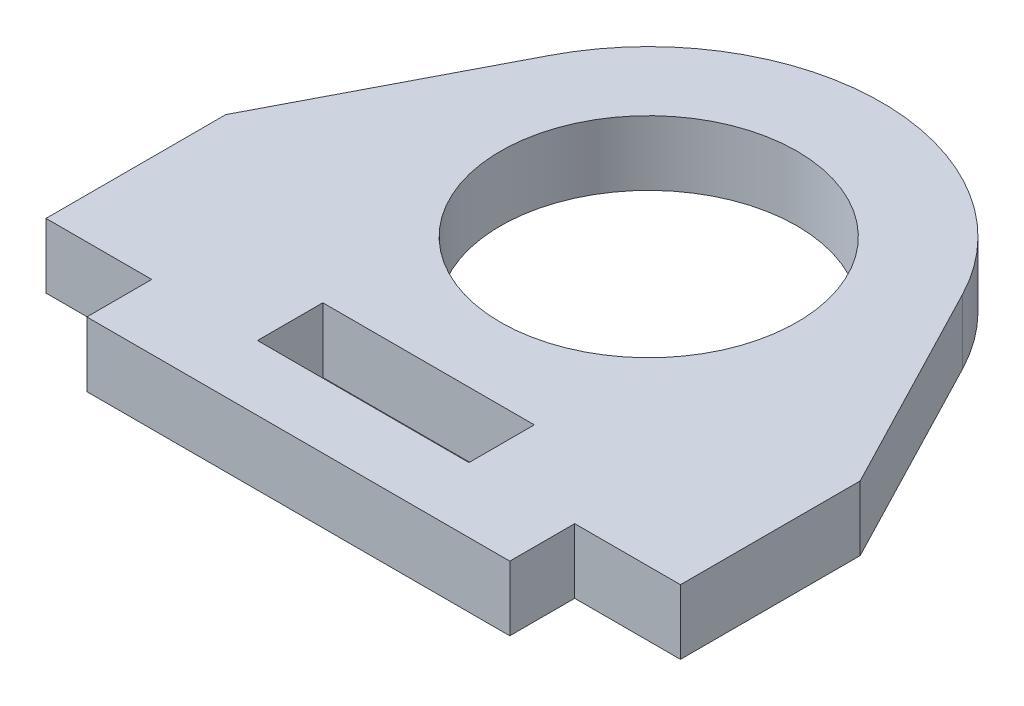
ISO-10303-21;
HEADER;
FILE_DESCRIPTION(('STEP AP214'),'2;1');
FILE_NAME('part.step','',(''),(''),'','','');
FILE_SCHEMA(('AUTOMOTIVE_DESIGN { 1 0 10303 214 1 1 1 1 }'));
ENDSEC;
DATA;
#1=APPLICATION_CONTEXT('core data for automotive mechanical design processes');
#2=APPLICATION_PROTOCOL_DEFINITION('international standard','automotive_design',2000,#1);
#3=PRODUCT_CONTEXT('',#1,'mechanical');
#4=PRODUCT('Part','Part','',(#3));
#5=PRODUCT_RELATED_PRODUCT_CATEGORY('part','',(#4));
#6=PRODUCT_DEFINITION_FORMATION('','',#4);
#7=PRODUCT_DEFINITION_CONTEXT('part definition',#1,'design');
#8=PRODUCT_DEFINITION('design','',#6,#7);
#9=PRODUCT_DEFINITION_SHAPE('','',#8);
#10=(LENGTH_UNIT() NAMED_UNIT(*) SI_UNIT(.MILLI.,.METRE.));
#11=(NAMED_UNIT(*) PLANE_ANGLE_UNIT() SI_UNIT($,.RADIAN.));
#12=(NAMED_UNIT(*) SI_UNIT($,.STERADIAN.) SOLID_ANGLE_UNIT());
#13=UNCERTAINTY_MEASURE_WITH_UNIT(LENGTH_MEASURE(1.E-05),#10,'distance_accuracy_value','');
#14=(GEOMETRIC_REPRESENTATION_CONTEXT(3) GLOBAL_UNCERTAINTY_ASSIGNED_CONTEXT((#13)) GLOBAL_UNIT_ASSIGNED_CONTEXT((#10,
#11,#12)) REPRESENTATION_CONTEXT('',''));
#15=CARTESIAN_POINT('',(0.,0.,0.));
#16=DIRECTION('',(0.,0.,1.));
#17=DIRECTION('',(1.,0.,0.));
#18=AXIS2_PLACEMENT_3D('',#15,#16,#17);
#19=CARTESIAN_POINT('',(-20.,-191.87,-16.57));
#20=DIRECTION('',(0.,1.,0.));
#21=DIRECTION('',(0.,0.,-1.));
#22=AXIS2_PLACEMENT_3D('',#19,#20,#21);
#23=PLANE('',#22);
#24=DIRECTION('',(0.,0.,-1.));
#25=VECTOR('',#24,1.);
#26=CARTESIAN_POINT('',(-15.,-191.87,-16.57));
#27=LINE('',#26,#25);
#28=CARTESIAN_POINT('',(-15.,-191.87,-3.07));
#29=VERTEX_POINT('',#28);
#30=CARTESIAN_POINT('',(-15.,-191.87,-6.16));
#31=VERTEX_POINT('',#30);
#32=EDGE_CURVE('E177',#29,#31,#27,.T.);
#33=ORIENTED_EDGE('',*,*,#32,.F.);
#34=DIRECTION('',(1.,0.,0.));
#35=VECTOR('',#34,1.);
#36=CARTESIAN_POINT('',(-20.,-191.87,-3.07));
#37=LINE('',#36,#35);
#38=CARTESIAN_POINT('',(-25.,-191.87,-3.07));
#39=VERTEX_POINT('',#38);
#40=EDGE_CURVE('E169',#39,#29,#37,.T.);
#41=ORIENTED_EDGE('',*,*,#40,.F.);
#42=DIRECTION('',(0.,0.,1.));
#43=VECTOR('',#42,1.);
#44=CARTESIAN_POINT('',(-25.,-191.87,-16.57));
#45=LINE('',#44,#43);
#46=CARTESIAN_POINT('',(-25.,-191.87,-6.16));
#47=VERTEX_POINT('',#46);
#48=EDGE_CURVE('E148',#47,#39,#45,.T.);
#49=ORIENTED_EDGE('',*,*,#48,.F.);
#50=DIRECTION('',(-1.,0.,0.));
#51=VECTOR('',#50,1.);
#52=CARTESIAN_POINT('',(-20.,-191.87,-6.16));
#53=LINE('',#52,#51);
#54=EDGE_CURVE('E174',#31,#47,#53,.T.);
#55=ORIENTED_EDGE('',*,*,#54,.F.);
#56=EDGE_LOOP('',(#33,#41,#49,#55));
#57=FACE_BOUND('',#56,.T.);
#58=DIRECTION('',(0.,0.,1.));
#59=VECTOR('',#58,1.);
#60=CARTESIAN_POINT('',(-35.,-191.87,-11.57));
#61=LINE('',#60,#59);
#62=CARTESIAN_POINT('',(-35.,-191.87,-11.57));
#63=VERTEX_POINT('',#62);
#64=CARTESIAN_POINT('',(-35.,-191.87,-3.07));
#65=VERTEX_POINT('',#64);
#66=EDGE_CURVE('E187',#63,#65,#61,.T.);
#67=ORIENTED_EDGE('',*,*,#66,.T.);
#68=DIRECTION('',(1.,0.,0.));
#69=VECTOR('',#68,1.);
#70=CARTESIAN_POINT('',(-35.,-191.87,-3.07));
#71=LINE('',#70,#69);
#72=CARTESIAN_POINT('',(-30.,-191.87,-3.07));
#73=VERTEX_POINT('',#72);
#74=EDGE_CURVE('E190',#65,#73,#71,.T.);
#75=ORIENTED_EDGE('',*,*,#74,.T.);
#76=DIRECTION('',(0.,0.,1.));
#77=VECTOR('',#76,1.);
#78=CARTESIAN_POINT('',(-30.,-191.87,-3.07));
#79=LINE('',#78,#77);
#80=CARTESIAN_POINT('',(-30.,-191.87,0.));
#81=VERTEX_POINT('',#80);
#82=EDGE_CURVE('E194',#73,#81,#79,.T.);
#83=ORIENTED_EDGE('',*,*,#82,.T.);
#84=DIRECTION('',(1.,0.,0.));
#85=VECTOR('',#84,1.);
#86=CARTESIAN_POINT('',(-30.,-191.87,0.));
#87=LINE('',#86,#85);
#88=CARTESIAN_POINT('',(-10.,-191.87,0.));
#89=VERTEX_POINT('',#88);
#90=EDGE_CURVE('E197',#81,#89,#87,.T.);
#91=ORIENTED_EDGE('',*,*,#90,.T.);
#92=DIRECTION('',(0.,0.,-1.));
#93=VECTOR('',#92,1.);
#94=CARTESIAN_POINT('',(-10.,-191.87,0.));
#95=LINE('',#94,#93);
#96=CARTESIAN_POINT('',(-10.,-191.87,-3.07));
#97=VERTEX_POINT('',#96);
#98=EDGE_CURVE('E200',#89,#97,#95,.T.);
#99=ORIENTED_EDGE('',*,*,#98,.T.);
#100=DIRECTION('',(1.,0.,0.));
#101=VECTOR('',#100,1.);
#102=CARTESIAN_POINT('',(-10.,-191.87,-3.07));
#103=LINE('',#102,#101);
#104=CARTESIAN_POINT('',(-5.,-191.87,-3.07));
#105=VERTEX_POINT('',#104);
#106=EDGE_CURVE('E203',#97,#105,#103,.T.);
#107=ORIENTED_EDGE('',*,*,#106,.T.);
#108=DIRECTION('',(0.,0.,-1.));
#109=VECTOR('',#108,1.);
#110=CARTESIAN_POINT('',(-5.,-191.87,-3.07));
#111=LINE('',#110,#109);
#112=CARTESIAN_POINT('',(-5.,-191.87,-11.57));
#113=VERTEX_POINT('',#112);
#114=EDGE_CURVE('E206',#105,#113,#111,.T.);
#115=ORIENTED_EDGE('',*,*,#114,.T.);
#116=DIRECTION('',(-0.460687391570735,0.,-0.887562463856912));
#117=VECTOR('',#116,1.);
#118=CARTESIAN_POINT('',(-5.,-191.87,-11.57));
#119=LINE('',#118,#117);
#120=CARTESIAN_POINT('',(-10.2279372729354,-191.87,-21.6421681811938));
#121=VERTEX_POINT('',#120);
#122=EDGE_CURVE('E209',#113,#121,#119,.T.);
#123=ORIENTED_EDGE('',*,*,#122,.T.);
#124=CARTESIAN_POINT('',(-20.,-191.87,-16.57));
#125=DIRECTION('',(0.,1.,0.));
#126=DIRECTION('',(0.,0.,-1.));
#127=AXIS2_PLACEMENT_3D('',#124,#125,#126);
#128=CIRCLE('',#127,11.01);
#129=CARTESIAN_POINT('',(-29.7720627270646,-191.87,-21.6421681811938));
#130=VERTEX_POINT('',#129);
#131=EDGE_CURVE('E212',#121,#130,#128,.T.);
#132=ORIENTED_EDGE('',*,*,#131,.T.);
#133=DIRECTION('',(-0.460687391570736,0.,0.887562463856911));
#134=VECTOR('',#133,1.);
#135=CARTESIAN_POINT('',(-35.,-191.87,-11.57));
#136=LINE('',#135,#134);
#137=EDGE_CURVE('E215',#130,#63,#136,.T.);
#138=ORIENTED_EDGE('',*,*,#137,.T.);
#139=EDGE_LOOP('',(#67,#75,#83,#91,#99,#107,#115,#123,#132,#138));
#140=FACE_BOUND('',#139,.T.);
#141=CARTESIAN_POINT('',(-20.,-191.87,-16.57));
#142=DIRECTION('',(0.,1.,0.));
#143=DIRECTION('',(0.,0.,-1.));
#144=AXIS2_PLACEMENT_3D('',#141,#142,#143);
#145=CIRCLE('',#144,7.01);
#146=CARTESIAN_POINT('',(-20.,-191.87,-23.58));
#147=VERTEX_POINT('',#146);
#148=EDGE_CURVE('E181',#147,#147,#145,.T.);
#149=ORIENTED_EDGE('',*,*,#148,.F.);
#150=EDGE_LOOP('',(#149));
#151=FACE_BOUND('',#150,.T.);
#152=ADVANCED_FACE('F45',(#57,#140,#151),#23,.T.);
#153=CARTESIAN_POINT('',(-20.,-194.93,-16.57));
#154=DIRECTION('',(0.,1.,0.));
#155=DIRECTION('',(0.,0.,-1.));
#156=AXIS2_PLACEMENT_3D('',#153,#154,#155);
#157=PLANE('',#156);
#158=DIRECTION('',(-1.,0.,0.));
#159=VECTOR('',#158,1.);
#160=CARTESIAN_POINT('',(-15.,-194.93,-3.07));
#161=LINE('',#160,#159);
#162=CARTESIAN_POINT('',(-15.,-194.93,-3.07));
#163=VERTEX_POINT('',#162);
#164=CARTESIAN_POINT('',(-25.,-194.93,-3.07));
#165=VERTEX_POINT('',#164);
#166=EDGE_CURVE('E157',#163,#165,#161,.T.);
#167=ORIENTED_EDGE('',*,*,#166,.F.);
#168=DIRECTION('',(0.,0.,1.));
#169=VECTOR('',#168,1.);
#170=CARTESIAN_POINT('',(-15.,-194.93,-3.07));
#171=LINE('',#170,#169);
#172=CARTESIAN_POINT('',(-15.,-194.93,-6.16));
#173=VERTEX_POINT('',#172);
#174=EDGE_CURVE('E162',#173,#163,#171,.T.);
#175=ORIENTED_EDGE('',*,*,#174,.F.);
#176=DIRECTION('',(1.,0.,0.));
#177=VECTOR('',#176,1.);
#178=CARTESIAN_POINT('',(-15.,-194.93,-6.16));
#179=LINE('',#178,#177);
#180=CARTESIAN_POINT('',(-25.,-194.93,-6.16));
#181=VERTEX_POINT('',#180);
#182=EDGE_CURVE('E159',#181,#173,#179,.T.);
#183=ORIENTED_EDGE('',*,*,#182,.F.);
#184=DIRECTION('',(0.,0.,-1.));
#185=VECTOR('',#184,1.);
#186=CARTESIAN_POINT('',(-25.,-194.93,-3.07));
#187=LINE('',#186,#185);
#188=EDGE_CURVE('E145',#165,#181,#187,.T.);
#189=ORIENTED_EDGE('',*,*,#188,.F.);
#190=EDGE_LOOP('',(#167,#175,#183,#189));
#191=FACE_BOUND('',#190,.T.);
#192=DIRECTION('',(0.,0.,1.));
#193=VECTOR('',#192,1.);
#194=CARTESIAN_POINT('',(-35.,-194.93,-11.57));
#195=LINE('',#194,#193);
#196=CARTESIAN_POINT('',(-35.,-194.93,-11.57));
#197=VERTEX_POINT('',#196);
#198=CARTESIAN_POINT('',(-35.,-194.93,-3.07));
#199=VERTEX_POINT('',#198);
#200=EDGE_CURVE('E184',#197,#199,#195,.T.);
#201=ORIENTED_EDGE('',*,*,#200,.F.);
#202=DIRECTION('',(-0.460687391570736,0.,0.887562463856911));
#203=VECTOR('',#202,1.);
#204=CARTESIAN_POINT('',(-35.,-194.93,-11.57));
#205=LINE('',#204,#203);
#206=CARTESIAN_POINT('',(-29.7720627270646,-194.93,-21.6421681811938));
#207=VERTEX_POINT('',#206);
#208=EDGE_CURVE('E191',#207,#197,#205,.T.);
#209=ORIENTED_EDGE('',*,*,#208,.F.);
#210=CARTESIAN_POINT('',(-20.,-194.93,-16.57));
#211=DIRECTION('',(0.,1.,0.));
#212=DIRECTION('',(0.,0.,-1.));
#213=AXIS2_PLACEMENT_3D('',#210,#211,#212);
#214=CIRCLE('',#213,11.01);
#215=CARTESIAN_POINT('',(-10.2279372729354,-194.93,-21.6421681811938));
#216=VERTEX_POINT('',#215);
#217=EDGE_CURVE('E242',#216,#207,#214,.T.);
#218=ORIENTED_EDGE('',*,*,#217,.F.);
#219=DIRECTION('',(-0.460687391570735,0.,-0.887562463856912));
#220=VECTOR('',#219,1.);
#221=CARTESIAN_POINT('',(-5.,-194.93,-11.57));
#222=LINE('',#221,#220);
#223=CARTESIAN_POINT('',(-5.,-194.93,-11.57));
#224=VERTEX_POINT('',#223);
#225=EDGE_CURVE('E239',#224,#216,#222,.T.);
#226=ORIENTED_EDGE('',*,*,#225,.F.);
#227=DIRECTION('',(0.,0.,-1.));
#228=VECTOR('',#227,1.);
#229=CARTESIAN_POINT('',(-5.,-194.93,-3.07));
#230=LINE('',#229,#228);
#231=CARTESIAN_POINT('',(-5.,-194.93,-3.07));
#232=VERTEX_POINT('',#231);
#233=EDGE_CURVE('E236',#232,#224,#230,.T.);
#234=ORIENTED_EDGE('',*,*,#233,.F.);
#235=DIRECTION('',(1.,0.,0.));
#236=VECTOR('',#235,1.);
#237=CARTESIAN_POINT('',(-10.,-194.93,-3.07));
#238=LINE('',#237,#236);
#239=CARTESIAN_POINT('',(-10.,-194.93,-3.07));
#240=VERTEX_POINT('',#239);
#241=EDGE_CURVE('E233',#240,#232,#238,.T.);
#242=ORIENTED_EDGE('',*,*,#241,.F.);
#243=DIRECTION('',(0.,0.,-1.));
#244=VECTOR('',#243,1.);
#245=CARTESIAN_POINT('',(-10.,-194.93,0.));
#246=LINE('',#245,#244);
#247=CARTESIAN_POINT('',(-10.,-194.93,0.));
#248=VERTEX_POINT('',#247);
#249=EDGE_CURVE('E230',#248,#240,#246,.T.);
#250=ORIENTED_EDGE('',*,*,#249,.F.);
#251=DIRECTION('',(1.,0.,0.));
#252=VECTOR('',#251,1.);
#253=CARTESIAN_POINT('',(-30.,-194.93,0.));
#254=LINE('',#253,#252);
#255=CARTESIAN_POINT('',(-30.,-194.93,0.));
#256=VERTEX_POINT('',#255);
#257=EDGE_CURVE('E227',#256,#248,#254,.T.);
#258=ORIENTED_EDGE('',*,*,#257,.F.);
#259=DIRECTION('',(0.,0.,1.));
#260=VECTOR('',#259,1.);
#261=CARTESIAN_POINT('',(-30.,-194.93,-3.07));
#262=LINE('',#261,#260);
#263=CARTESIAN_POINT('',(-30.,-194.93,-3.07));
#264=VERTEX_POINT('',#263);
#265=EDGE_CURVE('E224',#264,#256,#262,.T.);
#266=ORIENTED_EDGE('',*,*,#265,.F.);
#267=DIRECTION('',(1.,0.,0.));
#268=VECTOR('',#267,1.);
#269=CARTESIAN_POINT('',(-35.,-194.93,-3.07));
#270=LINE('',#269,#268);
#271=EDGE_CURVE('E221',#199,#264,#270,.T.);
#272=ORIENTED_EDGE('',*,*,#271,.F.);
#273=EDGE_LOOP('',(#201,#209,#218,#226,#234,#242,#250,#258,#266,#272));
#274=FACE_BOUND('',#273,.T.);
#275=CARTESIAN_POINT('',(-20.,-194.93,-16.57));
#276=DIRECTION('',(0.,1.,0.));
#277=DIRECTION('',(0.,0.,-1.));
#278=AXIS2_PLACEMENT_3D('',#275,#276,#277);
#279=CIRCLE('',#278,7.01);
#280=CARTESIAN_POINT('',(-20.,-194.93,-23.58));
#281=VERTEX_POINT('',#280);
#282=EDGE_CURVE('E180',#281,#281,#279,.T.);
#283=ORIENTED_EDGE('',*,*,#282,.T.);
#284=EDGE_LOOP('',(#283));
#285=FACE_BOUND('',#284,.T.);
#286=ADVANCED_FACE('F154',(#191,#274,#285),#157,.F.);
#287=CARTESIAN_POINT('',(-35.,-191.87,-11.57));
#288=DIRECTION('',(1.,0.,0.));
#289=DIRECTION('',(0.,0.,1.));
#290=AXIS2_PLACEMENT_3D('',#287,#288,#289);
#291=PLANE('',#290);
#292=ORIENTED_EDGE('',*,*,#200,.T.);
#293=DIRECTION('',(0.,-1.,0.));
#294=VECTOR('',#293,1.);
#295=CARTESIAN_POINT('',(-35.,-191.87,-3.07));
#296=LINE('',#295,#294);
#297=EDGE_CURVE('E12',#65,#199,#296,.T.);
#298=ORIENTED_EDGE('',*,*,#297,.F.);
#299=ORIENTED_EDGE('',*,*,#66,.F.);
#300=DIRECTION('',(0.,-1.,0.));
#301=VECTOR('',#300,1.);
#302=CARTESIAN_POINT('',(-35.,-191.87,-11.57));
#303=LINE('',#302,#301);
#304=EDGE_CURVE('E218',#63,#197,#303,.T.);
#305=ORIENTED_EDGE('',*,*,#304,.T.);
#306=EDGE_LOOP('',(#292,#298,#299,#305));
#307=FACE_BOUND('',#306,.T.);
#308=ADVANCED_FACE('F47',(#307),#291,.F.);
#309=CARTESIAN_POINT('',(-35.,-191.87,-3.07));
#310=DIRECTION('',(0.,0.,-1.));
#311=DIRECTION('',(1.,0.,0.));
#312=AXIS2_PLACEMENT_3D('',#309,#310,#311);
#313=PLANE('',#312);
#314=ORIENTED_EDGE('',*,*,#271,.T.);
#315=DIRECTION('',(0.,-1.,0.));
#316=VECTOR('',#315,1.);
#317=CARTESIAN_POINT('',(-30.,-191.87,-3.07));
#318=LINE('',#317,#316);
#319=EDGE_CURVE('E53',#73,#264,#318,.T.);
#320=ORIENTED_EDGE('',*,*,#319,.F.);
#321=ORIENTED_EDGE('',*,*,#74,.F.);
#322=ORIENTED_EDGE('',*,*,#297,.T.);
#323=EDGE_LOOP('',(#314,#320,#321,#322));
#324=FACE_BOUND('',#323,.T.);
#325=ADVANCED_FACE('F269',(#324),#313,.F.);
#326=CARTESIAN_POINT('',(-30.,-191.87,-3.07));
#327=DIRECTION('',(1.,0.,0.));
#328=DIRECTION('',(0.,0.,1.));
#329=AXIS2_PLACEMENT_3D('',#326,#327,#328);
#330=PLANE('',#329);
#331=ORIENTED_EDGE('',*,*,#265,.T.);
#332=DIRECTION('',(0.,-1.,0.));
#333=VECTOR('',#332,1.);
#334=CARTESIAN_POINT('',(-30.,-191.87,0.));
#335=LINE('',#334,#333);
#336=EDGE_CURVE('E260',#81,#256,#335,.T.);
#337=ORIENTED_EDGE('',*,*,#336,.F.);
#338=ORIENTED_EDGE('',*,*,#82,.F.);
#339=ORIENTED_EDGE('',*,*,#319,.T.);
#340=EDGE_LOOP('',(#331,#337,#338,#339));
#341=FACE_BOUND('',#340,.T.);
#342=ADVANCED_FACE('F263',(#341),#330,.F.);
#343=CARTESIAN_POINT('',(-30.,-191.87,0.));
#344=DIRECTION('',(0.,0.,-1.));
#345=DIRECTION('',(1.,0.,0.));
#346=AXIS2_PLACEMENT_3D('',#343,#344,#345);
#347=PLANE('',#346);
#348=ORIENTED_EDGE('',*,*,#257,.T.);
#349=DIRECTION('',(0.,-1.,0.));
#350=VECTOR('',#349,1.);
#351=CARTESIAN_POINT('',(-10.,-191.87,0.));
#352=LINE('',#351,#350);
#353=EDGE_CURVE('E258',#89,#248,#352,.T.);
#354=ORIENTED_EDGE('',*,*,#353,.F.);
#355=ORIENTED_EDGE('',*,*,#90,.F.);
#356=ORIENTED_EDGE('',*,*,#336,.T.);
#357=EDGE_LOOP('',(#348,#354,#355,#356));
#358=FACE_BOUND('',#357,.T.);
#359=ADVANCED_FACE('F275',(#358),#347,.F.);
#360=CARTESIAN_POINT('',(-10.,-191.87,0.));
#361=DIRECTION('',(-1.,0.,0.));
#362=DIRECTION('',(0.,0.,-1.));
#363=AXIS2_PLACEMENT_3D('',#360,#361,#362);
#364=PLANE('',#363);
#365=ORIENTED_EDGE('',*,*,#249,.T.);
#366=DIRECTION('',(0.,-1.,0.));
#367=VECTOR('',#366,1.);
#368=CARTESIAN_POINT('',(-10.,-191.87,-3.07));
#369=LINE('',#368,#367);
#370=EDGE_CURVE('E256',#97,#240,#369,.T.);
#371=ORIENTED_EDGE('',*,*,#370,.F.);
#372=ORIENTED_EDGE('',*,*,#98,.F.);
#373=ORIENTED_EDGE('',*,*,#353,.T.);
#374=EDGE_LOOP('',(#365,#371,#372,#373));
#375=FACE_BOUND('',#374,.T.);
#376=ADVANCED_FACE('F302',(#375),#364,.F.);
#377=CARTESIAN_POINT('',(-10.,-191.87,-3.07));
#378=DIRECTION('',(0.,0.,-1.));
#379=DIRECTION('',(1.,0.,0.));
#380=AXIS2_PLACEMENT_3D('',#377,#378,#379);
#381=PLANE('',#380);
#382=ORIENTED_EDGE('',*,*,#241,.T.);
#383=DIRECTION('',(0.,-1.,0.));
#384=VECTOR('',#383,1.);
#385=CARTESIAN_POINT('',(-5.,-191.87,-3.07));
#386=LINE('',#385,#384);
#387=EDGE_CURVE('E254',#105,#232,#386,.T.);
#388=ORIENTED_EDGE('',*,*,#387,.F.);
#389=ORIENTED_EDGE('',*,*,#106,.F.);
#390=ORIENTED_EDGE('',*,*,#370,.T.);
#391=EDGE_LOOP('',(#382,#388,#389,#390));
#392=FACE_BOUND('',#391,.T.);
#393=ADVANCED_FACE('F300',(#392),#381,.F.);
#394=CARTESIAN_POINT('',(-5.,-191.87,-3.07));
#395=DIRECTION('',(-1.,0.,0.));
#396=DIRECTION('',(0.,0.,-1.));
#397=AXIS2_PLACEMENT_3D('',#394,#395,#396);
#398=PLANE('',#397);
#399=ORIENTED_EDGE('',*,*,#233,.T.);
#400=DIRECTION('',(0.,-1.,0.));
#401=VECTOR('',#400,1.);
#402=CARTESIAN_POINT('',(-5.,-191.87,-11.57));
#403=LINE('',#402,#401);
#404=EDGE_CURVE('E252',#113,#224,#403,.T.);
#405=ORIENTED_EDGE('',*,*,#404,.F.);
#406=ORIENTED_EDGE('',*,*,#114,.F.);
#407=ORIENTED_EDGE('',*,*,#387,.T.);
#408=EDGE_LOOP('',(#399,#405,#406,#407));
#409=FACE_BOUND('',#408,.T.);
#410=ADVANCED_FACE('F296',(#409),#398,.F.);
#411=CARTESIAN_POINT('',(-5.,-191.87,-11.57));
#412=DIRECTION('',(-0.887562463856912,0.,0.460687391570735));
#413=DIRECTION('',(-0.460687391570735,0.,-0.887562463856912));
#414=AXIS2_PLACEMENT_3D('',#411,#412,#413);
#415=PLANE('',#414);
#416=ORIENTED_EDGE('',*,*,#225,.T.);
#417=DIRECTION('',(0.,-1.,0.));
#418=VECTOR('',#417,1.);
#419=CARTESIAN_POINT('',(-10.2279372729354,-191.87,-21.6421681811938));
#420=LINE('',#419,#418);
#421=EDGE_CURVE('E250',#121,#216,#420,.T.);
#422=ORIENTED_EDGE('',*,*,#421,.F.);
#423=ORIENTED_EDGE('',*,*,#122,.F.);
#424=ORIENTED_EDGE('',*,*,#404,.T.);
#425=EDGE_LOOP('',(#416,#422,#423,#424));
#426=FACE_BOUND('',#425,.T.);
#427=ADVANCED_FACE('F293',(#426),#415,.F.);
#428=CARTESIAN_POINT('',(-20.,-191.87,-16.57));
#429=DIRECTION('',(0.,-1.,0.));
#430=DIRECTION('',(0.,0.,1.));
#431=AXIS2_PLACEMENT_3D('',#428,#429,#430);
#432=CYLINDRICAL_SURFACE('',#431,11.01);
#433=ORIENTED_EDGE('',*,*,#217,.T.);
#434=DIRECTION('',(0.,-1.,0.));
#435=VECTOR('',#434,1.);
#436=CARTESIAN_POINT('',(-29.7720627270646,-191.87,-21.6421681811938));
#437=LINE('',#436,#435);
#438=EDGE_CURVE('E248',#130,#207,#437,.T.);
#439=ORIENTED_EDGE('',*,*,#438,.F.);
#440=ORIENTED_EDGE('',*,*,#131,.F.);
#441=ORIENTED_EDGE('',*,*,#421,.T.);
#442=EDGE_LOOP('',(#433,#439,#440,#441));
#443=FACE_BOUND('',#442,.T.);
#444=ADVANCED_FACE('F290',(#443),#432,.T.);
#445=CARTESIAN_POINT('',(-35.,-191.87,-11.57));
#446=DIRECTION('',(0.887562463856911,0.,0.460687391570736));
#447=DIRECTION('',(-0.460687391570736,0.,0.887562463856911));
#448=AXIS2_PLACEMENT_3D('',#445,#446,#447);
#449=PLANE('',#448);
#450=ORIENTED_EDGE('',*,*,#208,.T.);
#451=ORIENTED_EDGE('',*,*,#304,.F.);
#452=ORIENTED_EDGE('',*,*,#137,.F.);
#453=ORIENTED_EDGE('',*,*,#438,.T.);
#454=EDGE_LOOP('',(#450,#451,#452,#453));
#455=FACE_BOUND('',#454,.T.);
#456=ADVANCED_FACE('F287',(#455),#449,.F.);
#457=CARTESIAN_POINT('',(-20.,-191.87,-16.57));
#458=DIRECTION('',(0.,-1.,0.));
#459=DIRECTION('',(0.,0.,1.));
#460=AXIS2_PLACEMENT_3D('',#457,#458,#459);
#461=CYLINDRICAL_SURFACE('',#460,7.01);
#462=ORIENTED_EDGE('',*,*,#148,.T.);
#463=EDGE_LOOP('',(#462));
#464=FACE_BOUND('',#463,.T.);
#465=ORIENTED_EDGE('',*,*,#282,.F.);
#466=EDGE_LOOP('',(#465));
#467=FACE_BOUND('',#466,.T.);
#468=ADVANCED_FACE('F322',(#464,#467),#461,.F.);
#469=CARTESIAN_POINT('',(-15.,-78.76,-3.07));
#470=DIRECTION('',(1.,0.,0.));
#471=DIRECTION('',(0.,0.,1.));
#472=AXIS2_PLACEMENT_3D('',#469,#470,#471);
#473=PLANE('',#472);
#474=ORIENTED_EDGE('',*,*,#32,.T.);
#475=DIRECTION('',(0.,-1.,0.));
#476=VECTOR('',#475,1.);
#477=CARTESIAN_POINT('',(-15.,-78.76,-6.16));
#478=LINE('',#477,#476);
#479=EDGE_CURVE('E167',#31,#173,#478,.T.);
#480=ORIENTED_EDGE('',*,*,#479,.T.);
#481=ORIENTED_EDGE('',*,*,#174,.T.);
#482=DIRECTION('',(0.,-1.,0.));
#483=VECTOR('',#482,1.);
#484=CARTESIAN_POINT('',(-15.,-78.76,-3.07));
#485=LINE('',#484,#483);
#486=EDGE_CURVE('E65',#29,#163,#485,.T.);
#487=ORIENTED_EDGE('',*,*,#486,.F.);
#488=EDGE_LOOP('',(#474,#480,#481,#487));
#489=FACE_BOUND('',#488,.T.);
#490=ADVANCED_FACE('F361',(#489),#473,.F.);
#491=CARTESIAN_POINT('',(-15.,-78.76,-6.16));
#492=DIRECTION('',(0.,0.,-1.));
#493=DIRECTION('',(1.,0.,0.));
#494=AXIS2_PLACEMENT_3D('',#491,#492,#493);
#495=PLANE('',#494);
#496=ORIENTED_EDGE('',*,*,#54,.T.);
#497=DIRECTION('',(0.,-1.,0.));
#498=VECTOR('',#497,1.);
#499=CARTESIAN_POINT('',(-25.,-78.76,-6.16));
#500=LINE('',#499,#498);
#501=EDGE_CURVE('E150',#47,#181,#500,.T.);
#502=ORIENTED_EDGE('',*,*,#501,.T.);
#503=ORIENTED_EDGE('',*,*,#182,.T.);
#504=ORIENTED_EDGE('',*,*,#479,.F.);
#505=EDGE_LOOP('',(#496,#502,#503,#504));
#506=FACE_BOUND('',#505,.T.);
#507=ADVANCED_FACE('F369',(#506),#495,.F.);
#508=CARTESIAN_POINT('',(-25.,-78.76,-3.07));
#509=DIRECTION('',(-1.,0.,0.));
#510=DIRECTION('',(0.,0.,-1.));
#511=AXIS2_PLACEMENT_3D('',#508,#509,#510);
#512=PLANE('',#511);
#513=ORIENTED_EDGE('',*,*,#48,.T.);
#514=DIRECTION('',(0.,-1.,0.));
#515=VECTOR('',#514,1.);
#516=CARTESIAN_POINT('',(-25.,-78.76,-3.07));
#517=LINE('',#516,#515);
#518=EDGE_CURVE('E60',#39,#165,#517,.T.);
#519=ORIENTED_EDGE('',*,*,#518,.T.);
#520=ORIENTED_EDGE('',*,*,#188,.T.);
#521=ORIENTED_EDGE('',*,*,#501,.F.);
#522=EDGE_LOOP('',(#513,#519,#520,#521));
#523=FACE_BOUND('',#522,.T.);
#524=ADVANCED_FACE('F144',(#523),#512,.F.);
#525=CARTESIAN_POINT('',(-15.,-78.76,-3.07));
#526=DIRECTION('',(0.,0.,1.));
#527=DIRECTION('',(-1.,0.,0.));
#528=AXIS2_PLACEMENT_3D('',#525,#526,#527);
#529=PLANE('',#528);
#530=ORIENTED_EDGE('',*,*,#40,.T.);
#531=ORIENTED_EDGE('',*,*,#486,.T.);
#532=ORIENTED_EDGE('',*,*,#166,.T.);
#533=ORIENTED_EDGE('',*,*,#518,.F.);
#534=EDGE_LOOP('',(#530,#531,#532,#533));
#535=FACE_BOUND('',#534,.T.);
#536=ADVANCED_FACE('F161',(#535),#529,.F.);
#537=CLOSED_SHELL('',(#152,#286,#308,#325,#342,#359,#376,#393,#410,#427,#444,#456,#468,#490,
#507,#524,#536));
#538=MANIFOLD_SOLID_BREP('B2',#537);
#539=ADVANCED_BREP_SHAPE_REPRESENTATION('',(#18,#538),#14);
#540=SHAPE_DEFINITION_REPRESENTATION(#9,#539);
ENDSEC;
END-ISO-10303-21;
